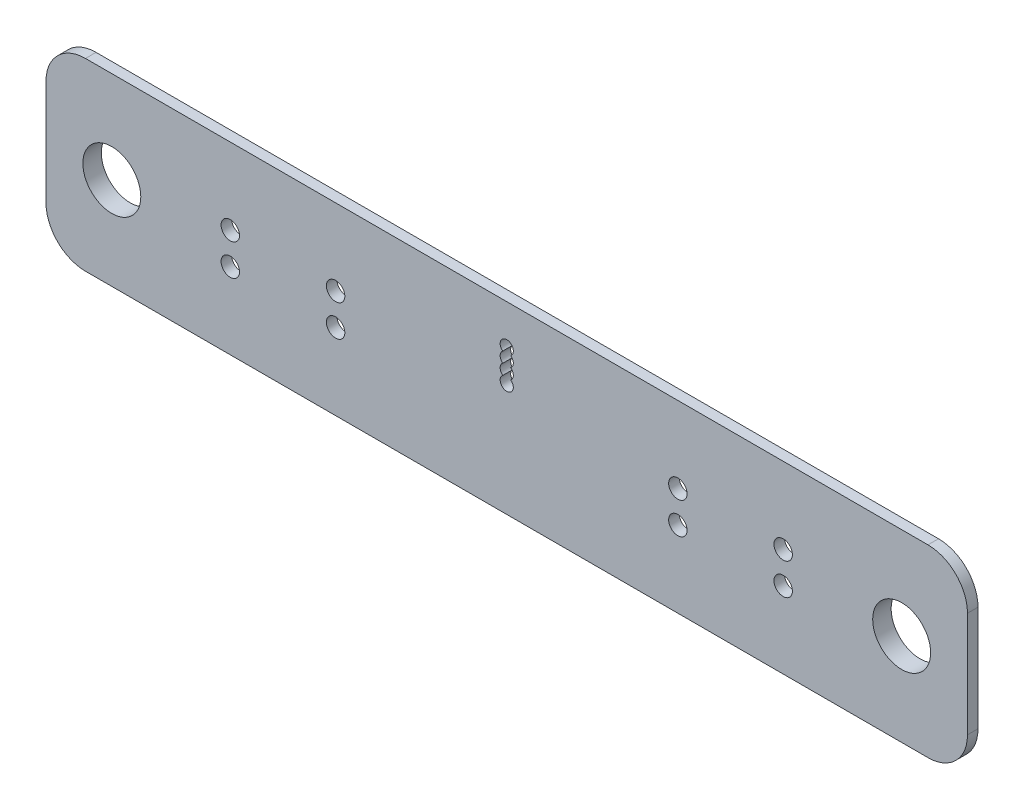
ISO-10303-21;
HEADER;
FILE_DESCRIPTION(('STEP AP214'),'2;1');
FILE_NAME('part.step','',(''),(''),'','','');
FILE_SCHEMA(('AUTOMOTIVE_DESIGN { 1 0 10303 214 1 1 1 1 }'));
ENDSEC;
DATA;
#1=APPLICATION_CONTEXT('core data for automotive mechanical design processes');
#2=APPLICATION_PROTOCOL_DEFINITION('international standard','automotive_design',2000,#1);
#3=PRODUCT_CONTEXT('',#1,'mechanical');
#4=PRODUCT('Part','Part','',(#3));
#5=PRODUCT_RELATED_PRODUCT_CATEGORY('part','',(#4));
#6=PRODUCT_DEFINITION_FORMATION('','',#4);
#7=PRODUCT_DEFINITION_CONTEXT('part definition',#1,'design');
#8=PRODUCT_DEFINITION('design','',#6,#7);
#9=PRODUCT_DEFINITION_SHAPE('','',#8);
#10=(LENGTH_UNIT() NAMED_UNIT(*) SI_UNIT(.MILLI.,.METRE.));
#11=(NAMED_UNIT(*) PLANE_ANGLE_UNIT() SI_UNIT($,.RADIAN.));
#12=(NAMED_UNIT(*) SI_UNIT($,.STERADIAN.) SOLID_ANGLE_UNIT());
#13=UNCERTAINTY_MEASURE_WITH_UNIT(LENGTH_MEASURE(1.E-05),#10,'distance_accuracy_value','');
#14=(GEOMETRIC_REPRESENTATION_CONTEXT(3) GLOBAL_UNCERTAINTY_ASSIGNED_CONTEXT((#13)) GLOBAL_UNIT_ASSIGNED_CONTEXT((#10,
#11,#12)) REPRESENTATION_CONTEXT('',''));
#15=CARTESIAN_POINT('',(0.,0.,0.));
#16=DIRECTION('',(0.,0.,1.));
#17=DIRECTION('',(1.,0.,0.));
#18=AXIS2_PLACEMENT_3D('',#15,#16,#17);
#19=CARTESIAN_POINT('',(0.,0.,0.));
#20=DIRECTION('',(0.,0.,1.));
#21=DIRECTION('',(1.,0.,0.));
#22=AXIS2_PLACEMENT_3D('',#19,#20,#21);
#23=PLANE('',#22);
#24=CARTESIAN_POINT('',(150.,0.,0.));
#25=DIRECTION('',(0.,0.,1.));
#26=DIRECTION('',(1.,0.,0.));
#27=AXIS2_PLACEMENT_3D('',#24,#25,#26);
#28=CIRCLE('',#27,13.5);
#29=CARTESIAN_POINT('',(163.5,0.,0.));
#30=VERTEX_POINT('',#29);
#31=EDGE_CURVE('E42',#30,#30,#28,.F.);
#32=ORIENTED_EDGE('',*,*,#31,.F.);
#33=EDGE_LOOP('',(#32));
#34=FACE_BOUND('',#33,.T.);
#35=CARTESIAN_POINT('',(105.,6.,0.));
#36=DIRECTION('',(0.,0.,1.));
#37=DIRECTION('',(1.,0.,0.));
#38=AXIS2_PLACEMENT_3D('',#35,#36,#37);
#39=CIRCLE('',#38,3.50000000000001);
#40=CARTESIAN_POINT('',(108.5,6.,0.));
#41=VERTEX_POINT('',#40);
#42=EDGE_CURVE('E214',#41,#41,#39,.T.);
#43=ORIENTED_EDGE('',*,*,#42,.T.);
#44=EDGE_LOOP('',(#43));
#45=FACE_BOUND('',#44,.T.);
#46=CARTESIAN_POINT('',(-105.,-6.,0.));
#47=DIRECTION('',(0.,0.,1.));
#48=DIRECTION('',(1.,0.,0.));
#49=AXIS2_PLACEMENT_3D('',#46,#47,#48);
#50=CIRCLE('',#49,3.50000000000001);
#51=CARTESIAN_POINT('',(-101.5,-6.,0.));
#52=VERTEX_POINT('',#51);
#53=EDGE_CURVE('E211',#52,#52,#50,.T.);
#54=ORIENTED_EDGE('',*,*,#53,.T.);
#55=EDGE_LOOP('',(#54));
#56=FACE_BOUND('',#55,.T.);
#57=CARTESIAN_POINT('',(-65.,-6.,0.));
#58=DIRECTION('',(0.,0.,1.));
#59=DIRECTION('',(1.,0.,0.));
#60=AXIS2_PLACEMENT_3D('',#57,#58,#59);
#61=CIRCLE('',#60,3.50000000000001);
#62=CARTESIAN_POINT('',(-61.5,-6.,0.));
#63=VERTEX_POINT('',#62);
#64=EDGE_CURVE('E208',#63,#63,#61,.T.);
#65=ORIENTED_EDGE('',*,*,#64,.T.);
#66=EDGE_LOOP('',(#65));
#67=FACE_BOUND('',#66,.T.);
#68=CARTESIAN_POINT('',(-65.,6.,0.));
#69=DIRECTION('',(0.,0.,1.));
#70=DIRECTION('',(1.,0.,0.));
#71=AXIS2_PLACEMENT_3D('',#68,#69,#70);
#72=CIRCLE('',#71,3.50000000000001);
#73=CARTESIAN_POINT('',(-61.5,6.,0.));
#74=VERTEX_POINT('',#73);
#75=EDGE_CURVE('E205',#74,#74,#72,.T.);
#76=ORIENTED_EDGE('',*,*,#75,.T.);
#77=EDGE_LOOP('',(#76));
#78=FACE_BOUND('',#77,.T.);
#79=CARTESIAN_POINT('',(65.,6.,0.));
#80=DIRECTION('',(0.,0.,1.));
#81=DIRECTION('',(1.,0.,0.));
#82=AXIS2_PLACEMENT_3D('',#79,#80,#81);
#83=CIRCLE('',#82,3.50000000000001);
#84=CARTESIAN_POINT('',(68.5,6.,0.));
#85=VERTEX_POINT('',#84);
#86=EDGE_CURVE('E202',#85,#85,#83,.T.);
#87=ORIENTED_EDGE('',*,*,#86,.T.);
#88=EDGE_LOOP('',(#87));
#89=FACE_BOUND('',#88,.T.);
#90=CARTESIAN_POINT('',(65.,-6.,0.));
#91=DIRECTION('',(0.,0.,1.));
#92=DIRECTION('',(1.,0.,0.));
#93=AXIS2_PLACEMENT_3D('',#90,#91,#92);
#94=CIRCLE('',#93,3.50000000000001);
#95=CARTESIAN_POINT('',(68.5,-6.,0.));
#96=VERTEX_POINT('',#95);
#97=EDGE_CURVE('E199',#96,#96,#94,.T.);
#98=ORIENTED_EDGE('',*,*,#97,.T.);
#99=EDGE_LOOP('',(#98));
#100=FACE_BOUND('',#99,.T.);
#101=CARTESIAN_POINT('',(105.,-6.,0.));
#102=DIRECTION('',(0.,0.,1.));
#103=DIRECTION('',(1.,0.,0.));
#104=AXIS2_PLACEMENT_3D('',#101,#102,#103);
#105=CIRCLE('',#104,3.50000000000001);
#106=CARTESIAN_POINT('',(108.5,-6.,0.));
#107=VERTEX_POINT('',#106);
#108=EDGE_CURVE('E196',#107,#107,#105,.T.);
#109=ORIENTED_EDGE('',*,*,#108,.T.);
#110=EDGE_LOOP('',(#109));
#111=FACE_BOUND('',#110,.T.);
#112=CARTESIAN_POINT('',(0.,12.,0.));
#113=DIRECTION('',(0.,0.,1.));
#114=DIRECTION('',(1.,0.,0.));
#115=AXIS2_PLACEMENT_3D('',#112,#113,#114);
#116=CIRCLE('',#115,2.5);
#117=CARTESIAN_POINT('',(1.50000000000011,10.,0.));
#118=VERTEX_POINT('',#117);
#119=CARTESIAN_POINT('',(1.50000000000006,14.,0.));
#120=VERTEX_POINT('',#119);
#121=EDGE_CURVE('E190',#118,#120,#116,.T.);
#122=ORIENTED_EDGE('',*,*,#121,.T.);
#123=CARTESIAN_POINT('',(0.,16.,0.));
#124=DIRECTION('',(0.,0.,1.));
#125=DIRECTION('',(1.,0.,0.));
#126=AXIS2_PLACEMENT_3D('',#123,#124,#125);
#127=CIRCLE('',#126,2.5);
#128=CARTESIAN_POINT('',(1.50000000000002,18.,0.));
#129=VERTEX_POINT('',#128);
#130=EDGE_CURVE('E193',#120,#129,#127,.T.);
#131=ORIENTED_EDGE('',*,*,#130,.T.);
#132=CARTESIAN_POINT('',(0.,20.,0.));
#133=DIRECTION('',(0.,0.,1.));
#134=DIRECTION('',(1.,0.,0.));
#135=AXIS2_PLACEMENT_3D('',#132,#133,#134);
#136=CIRCLE('',#135,2.5);
#137=CARTESIAN_POINT('',(-1.49999999999998,18.,0.));
#138=VERTEX_POINT('',#137);
#139=EDGE_CURVE('E178',#129,#138,#136,.T.);
#140=ORIENTED_EDGE('',*,*,#139,.T.);
#141=CARTESIAN_POINT('',(0.,16.,0.));
#142=DIRECTION('',(0.,0.,1.));
#143=DIRECTION('',(1.,0.,0.));
#144=AXIS2_PLACEMENT_3D('',#141,#142,#143);
#145=CIRCLE('',#144,2.5);
#146=CARTESIAN_POINT('',(-1.49999999999994,14.,0.));
#147=VERTEX_POINT('',#146);
#148=EDGE_CURVE('E141',#138,#147,#145,.T.);
#149=ORIENTED_EDGE('',*,*,#148,.T.);
#150=CARTESIAN_POINT('',(0.,12.,0.));
#151=DIRECTION('',(0.,0.,1.));
#152=DIRECTION('',(1.,0.,0.));
#153=AXIS2_PLACEMENT_3D('',#150,#151,#152);
#154=CIRCLE('',#153,2.5);
#155=CARTESIAN_POINT('',(-1.49999999999989,9.99999999999998,0.));
#156=VERTEX_POINT('',#155);
#157=EDGE_CURVE('E184',#147,#156,#154,.T.);
#158=ORIENTED_EDGE('',*,*,#157,.T.);
#159=CARTESIAN_POINT('',(1.26305651597926E-13,8.,0.));
#160=DIRECTION('',(0.,0.,1.));
#161=DIRECTION('',(1.,0.,0.));
#162=AXIS2_PLACEMENT_3D('',#159,#160,#161);
#163=CIRCLE('',#162,2.5);
#164=EDGE_CURVE('E187',#156,#118,#163,.T.);
#165=ORIENTED_EDGE('',*,*,#164,.T.);
#166=EDGE_LOOP('',(#122,#131,#140,#149,#158,#165));
#167=FACE_BOUND('',#166,.T.);
#168=CARTESIAN_POINT('',(-105.,6.,0.));
#169=DIRECTION('',(0.,0.,1.));
#170=DIRECTION('',(1.,0.,0.));
#171=AXIS2_PLACEMENT_3D('',#168,#169,#170);
#172=CIRCLE('',#171,3.50000000000001);
#173=CARTESIAN_POINT('',(-101.5,6.,0.));
#174=VERTEX_POINT('',#173);
#175=EDGE_CURVE('E220',#174,#174,#172,.T.);
#176=ORIENTED_EDGE('',*,*,#175,.T.);
#177=EDGE_LOOP('',(#176));
#178=FACE_BOUND('',#177,.T.);
#179=DIRECTION('',(0.,1.,0.));
#180=VECTOR('',#179,1.);
#181=CARTESIAN_POINT('',(175.,35.,0.));
#182=LINE('',#181,#180);
#183=CARTESIAN_POINT('',(175.,-20.,0.));
#184=VERTEX_POINT('',#183);
#185=CARTESIAN_POINT('',(175.,20.,0.));
#186=VERTEX_POINT('',#185);
#187=EDGE_CURVE('E227',#184,#186,#182,.T.);
#188=ORIENTED_EDGE('',*,*,#187,.F.);
#189=CARTESIAN_POINT('',(160.,-20.,0.));
#190=DIRECTION('',(0.,0.,1.));
#191=DIRECTION('',(1.,0.,0.));
#192=AXIS2_PLACEMENT_3D('',#189,#190,#191);
#193=CIRCLE('',#192,15.);
#194=CARTESIAN_POINT('',(160.,-35.,0.));
#195=VERTEX_POINT('',#194);
#196=EDGE_CURVE('E262',#184,#195,#193,.F.);
#197=ORIENTED_EDGE('',*,*,#196,.T.);
#198=DIRECTION('',(1.,0.,0.));
#199=VECTOR('',#198,1.);
#200=CARTESIAN_POINT('',(-175.,-35.,0.));
#201=LINE('',#200,#199);
#202=CARTESIAN_POINT('',(-160.,-35.,0.));
#203=VERTEX_POINT('',#202);
#204=EDGE_CURVE('E232',#203,#195,#201,.T.);
#205=ORIENTED_EDGE('',*,*,#204,.F.);
#206=CARTESIAN_POINT('',(-160.,-20.,0.));
#207=DIRECTION('',(0.,0.,1.));
#208=DIRECTION('',(1.,0.,0.));
#209=AXIS2_PLACEMENT_3D('',#206,#207,#208);
#210=CIRCLE('',#209,15.);
#211=CARTESIAN_POINT('',(-175.,-20.,0.));
#212=VERTEX_POINT('',#211);
#213=EDGE_CURVE('E258',#203,#212,#210,.F.);
#214=ORIENTED_EDGE('',*,*,#213,.T.);
#215=DIRECTION('',(0.,-1.,0.));
#216=VECTOR('',#215,1.);
#217=CARTESIAN_POINT('',(-175.,35.,0.));
#218=LINE('',#217,#216);
#219=CARTESIAN_POINT('',(-175.,20.,0.));
#220=VERTEX_POINT('',#219);
#221=EDGE_CURVE('E247',#220,#212,#218,.T.);
#222=ORIENTED_EDGE('',*,*,#221,.F.);
#223=CARTESIAN_POINT('',(-160.,20.,0.));
#224=DIRECTION('',(0.,0.,1.));
#225=DIRECTION('',(1.,0.,0.));
#226=AXIS2_PLACEMENT_3D('',#223,#224,#225);
#227=CIRCLE('',#226,15.);
#228=CARTESIAN_POINT('',(-160.,35.,0.));
#229=VERTEX_POINT('',#228);
#230=EDGE_CURVE('E256',#220,#229,#227,.F.);
#231=ORIENTED_EDGE('',*,*,#230,.T.);
#232=DIRECTION('',(-1.,0.,0.));
#233=VECTOR('',#232,1.);
#234=CARTESIAN_POINT('',(-175.,35.,0.));
#235=LINE('',#234,#233);
#236=CARTESIAN_POINT('',(160.,35.,0.));
#237=VERTEX_POINT('',#236);
#238=EDGE_CURVE('E244',#237,#229,#235,.T.);
#239=ORIENTED_EDGE('',*,*,#238,.F.);
#240=CARTESIAN_POINT('',(160.,20.,0.));
#241=DIRECTION('',(0.,0.,1.));
#242=DIRECTION('',(1.,0.,0.));
#243=AXIS2_PLACEMENT_3D('',#240,#241,#242);
#244=CIRCLE('',#243,15.);
#245=EDGE_CURVE('E260',#237,#186,#244,.F.);
#246=ORIENTED_EDGE('',*,*,#245,.T.);
#247=EDGE_LOOP('',(#188,#197,#205,#214,#222,#231,#239,#246));
#248=FACE_BOUND('',#247,.T.);
#249=CARTESIAN_POINT('',(-150.,0.,0.));
#250=DIRECTION('',(0.,0.,1.));
#251=DIRECTION('',(1.,0.,0.));
#252=AXIS2_PLACEMENT_3D('',#249,#250,#251);
#253=CIRCLE('',#252,13.5);
#254=CARTESIAN_POINT('',(-136.5,0.,0.));
#255=VERTEX_POINT('',#254);
#256=EDGE_CURVE('E11',#255,#255,#253,.F.);
#257=ORIENTED_EDGE('',*,*,#256,.F.);
#258=EDGE_LOOP('',(#257));
#259=FACE_BOUND('',#258,.T.);
#260=ADVANCED_FACE('F34',(#34,#45,#56,#67,#78,#89,#100,#111,#167,#178,#248,#259),#23,.F.);
#261=CARTESIAN_POINT('',(175.,35.,4.));
#262=DIRECTION('',(-1.,0.,0.));
#263=DIRECTION('',(0.,-1.,0.));
#264=AXIS2_PLACEMENT_3D('',#261,#262,#263);
#265=PLANE('',#264);
#266=DIRECTION('',(0.,1.,0.));
#267=VECTOR('',#266,1.);
#268=CARTESIAN_POINT('',(175.,35.,4.));
#269=LINE('',#268,#267);
#270=CARTESIAN_POINT('',(175.,-20.,4.));
#271=VERTEX_POINT('',#270);
#272=CARTESIAN_POINT('',(175.,20.,4.));
#273=VERTEX_POINT('',#272);
#274=EDGE_CURVE('E228',#271,#273,#269,.T.);
#275=ORIENTED_EDGE('',*,*,#274,.F.);
#276=DIRECTION('',(0.,0.,-1.));
#277=VECTOR('',#276,1.);
#278=CARTESIAN_POINT('',(175.,-20.,4.));
#279=LINE('',#278,#277);
#280=EDGE_CURVE('E253',#271,#184,#279,.T.);
#281=ORIENTED_EDGE('',*,*,#280,.T.);
#282=ORIENTED_EDGE('',*,*,#187,.T.);
#283=DIRECTION('',(0.,0.,-1.));
#284=VECTOR('',#283,1.);
#285=CARTESIAN_POINT('',(175.,20.,4.));
#286=LINE('',#285,#284);
#287=EDGE_CURVE('E241',#186,#273,#286,.F.);
#288=ORIENTED_EDGE('',*,*,#287,.T.);
#289=EDGE_LOOP('',(#275,#281,#282,#288));
#290=FACE_BOUND('',#289,.T.);
#291=ADVANCED_FACE('F295',(#290),#265,.F.);
#292=CARTESIAN_POINT('',(-175.,35.,4.));
#293=DIRECTION('',(0.,-1.,0.));
#294=DIRECTION('',(0.,0.,-1.));
#295=AXIS2_PLACEMENT_3D('',#292,#293,#294);
#296=PLANE('',#295);
#297=DIRECTION('',(-1.,0.,0.));
#298=VECTOR('',#297,1.);
#299=CARTESIAN_POINT('',(-175.,35.,4.));
#300=LINE('',#299,#298);
#301=CARTESIAN_POINT('',(160.,35.,4.));
#302=VERTEX_POINT('',#301);
#303=CARTESIAN_POINT('',(-160.,35.,4.));
#304=VERTEX_POINT('',#303);
#305=EDGE_CURVE('E231',#302,#304,#300,.T.);
#306=ORIENTED_EDGE('',*,*,#305,.F.);
#307=DIRECTION('',(0.,0.,-1.));
#308=VECTOR('',#307,1.);
#309=CARTESIAN_POINT('',(160.,35.,4.));
#310=LINE('',#309,#308);
#311=EDGE_CURVE('E279',#302,#237,#310,.T.);
#312=ORIENTED_EDGE('',*,*,#311,.T.);
#313=ORIENTED_EDGE('',*,*,#238,.T.);
#314=DIRECTION('',(0.,0.,-1.));
#315=VECTOR('',#314,1.);
#316=CARTESIAN_POINT('',(-160.,35.,4.));
#317=LINE('',#316,#315);
#318=EDGE_CURVE('E277',#229,#304,#317,.F.);
#319=ORIENTED_EDGE('',*,*,#318,.T.);
#320=EDGE_LOOP('',(#306,#312,#313,#319));
#321=FACE_BOUND('',#320,.T.);
#322=ADVANCED_FACE('F407',(#321),#296,.F.);
#323=CARTESIAN_POINT('',(-175.,35.,4.));
#324=DIRECTION('',(1.,0.,0.));
#325=DIRECTION('',(0.,0.,-1.));
#326=AXIS2_PLACEMENT_3D('',#323,#324,#325);
#327=PLANE('',#326);
#328=ORIENTED_EDGE('',*,*,#221,.T.);
#329=DIRECTION('',(0.,0.,-1.));
#330=VECTOR('',#329,1.);
#331=CARTESIAN_POINT('',(-175.,-20.,4.));
#332=LINE('',#331,#330);
#333=CARTESIAN_POINT('',(-175.,-20.,4.));
#334=VERTEX_POINT('',#333);
#335=EDGE_CURVE('E285',#212,#334,#332,.F.);
#336=ORIENTED_EDGE('',*,*,#335,.T.);
#337=DIRECTION('',(0.,-1.,0.));
#338=VECTOR('',#337,1.);
#339=CARTESIAN_POINT('',(-175.,35.,4.));
#340=LINE('',#339,#338);
#341=CARTESIAN_POINT('',(-175.,20.,4.));
#342=VERTEX_POINT('',#341);
#343=EDGE_CURVE('E235',#342,#334,#340,.T.);
#344=ORIENTED_EDGE('',*,*,#343,.F.);
#345=DIRECTION('',(0.,0.,-1.));
#346=VECTOR('',#345,1.);
#347=CARTESIAN_POINT('',(-175.,20.,4.));
#348=LINE('',#347,#346);
#349=EDGE_CURVE('E282',#342,#220,#348,.T.);
#350=ORIENTED_EDGE('',*,*,#349,.T.);
#351=EDGE_LOOP('',(#328,#336,#344,#350));
#352=FACE_BOUND('',#351,.T.);
#353=ADVANCED_FACE('F403',(#352),#327,.F.);
#354=CARTESIAN_POINT('',(-175.,-35.,4.));
#355=DIRECTION('',(0.,1.,0.));
#356=DIRECTION('',(0.,0.,1.));
#357=AXIS2_PLACEMENT_3D('',#354,#355,#356);
#358=PLANE('',#357);
#359=ORIENTED_EDGE('',*,*,#204,.T.);
#360=DIRECTION('',(0.,0.,-1.));
#361=VECTOR('',#360,1.);
#362=CARTESIAN_POINT('',(160.,-35.,4.));
#363=LINE('',#362,#361);
#364=CARTESIAN_POINT('',(160.,-35.,4.));
#365=VERTEX_POINT('',#364);
#366=EDGE_CURVE('E267',#195,#365,#363,.F.);
#367=ORIENTED_EDGE('',*,*,#366,.T.);
#368=DIRECTION('',(1.,0.,0.));
#369=VECTOR('',#368,1.);
#370=CARTESIAN_POINT('',(-175.,-35.,4.));
#371=LINE('',#370,#369);
#372=CARTESIAN_POINT('',(-160.,-35.,4.));
#373=VERTEX_POINT('',#372);
#374=EDGE_CURVE('E238',#373,#365,#371,.T.);
#375=ORIENTED_EDGE('',*,*,#374,.F.);
#376=DIRECTION('',(0.,0.,-1.));
#377=VECTOR('',#376,1.);
#378=CARTESIAN_POINT('',(-160.,-35.,4.));
#379=LINE('',#378,#377);
#380=EDGE_CURVE('E264',#373,#203,#379,.T.);
#381=ORIENTED_EDGE('',*,*,#380,.T.);
#382=EDGE_LOOP('',(#359,#367,#375,#381));
#383=FACE_BOUND('',#382,.T.);
#384=ADVANCED_FACE('F398',(#383),#358,.F.);
#385=CARTESIAN_POINT('',(0.,0.,4.));
#386=DIRECTION('',(0.,0.,1.));
#387=DIRECTION('',(1.,0.,0.));
#388=AXIS2_PLACEMENT_3D('',#385,#386,#387);
#389=PLANE('',#388);
#390=CARTESIAN_POINT('',(105.,6.,4.));
#391=DIRECTION('',(0.,0.,1.));
#392=DIRECTION('',(-1.,0.,0.));
#393=AXIS2_PLACEMENT_3D('',#390,#391,#392);
#394=CIRCLE('',#393,3.50000000000001);
#395=CARTESIAN_POINT('',(101.5,6.,4.));
#396=VERTEX_POINT('',#395);
#397=EDGE_CURVE('E642',#396,#396,#394,.T.);
#398=ORIENTED_EDGE('',*,*,#397,.F.);
#399=EDGE_LOOP('',(#398));
#400=FACE_BOUND('',#399,.T.);
#401=CARTESIAN_POINT('',(-105.,-6.,4.));
#402=DIRECTION('',(0.,0.,1.));
#403=DIRECTION('',(1.,0.,0.));
#404=AXIS2_PLACEMENT_3D('',#401,#402,#403);
#405=CIRCLE('',#404,3.50000000000001);
#406=CARTESIAN_POINT('',(-101.5,-6.,4.));
#407=VERTEX_POINT('',#406);
#408=EDGE_CURVE('E646',#407,#407,#405,.T.);
#409=ORIENTED_EDGE('',*,*,#408,.F.);
#410=EDGE_LOOP('',(#409));
#411=FACE_BOUND('',#410,.T.);
#412=CARTESIAN_POINT('',(-65.,-6.,4.));
#413=DIRECTION('',(0.,0.,1.));
#414=DIRECTION('',(1.,0.,0.));
#415=AXIS2_PLACEMENT_3D('',#412,#413,#414);
#416=CIRCLE('',#415,3.50000000000001);
#417=CARTESIAN_POINT('',(-61.5,-6.,4.));
#418=VERTEX_POINT('',#417);
#419=EDGE_CURVE('E650',#418,#418,#416,.T.);
#420=ORIENTED_EDGE('',*,*,#419,.F.);
#421=EDGE_LOOP('',(#420));
#422=FACE_BOUND('',#421,.T.);
#423=CARTESIAN_POINT('',(-65.,6.,4.));
#424=DIRECTION('',(0.,0.,1.));
#425=DIRECTION('',(1.,0.,0.));
#426=AXIS2_PLACEMENT_3D('',#423,#424,#425);
#427=CIRCLE('',#426,3.50000000000001);
#428=CARTESIAN_POINT('',(-61.5,6.,4.));
#429=VERTEX_POINT('',#428);
#430=EDGE_CURVE('E654',#429,#429,#427,.T.);
#431=ORIENTED_EDGE('',*,*,#430,.F.);
#432=EDGE_LOOP('',(#431));
#433=FACE_BOUND('',#432,.T.);
#434=CARTESIAN_POINT('',(65.,6.,4.));
#435=DIRECTION('',(0.,0.,1.));
#436=DIRECTION('',(-1.,0.,0.));
#437=AXIS2_PLACEMENT_3D('',#434,#435,#436);
#438=CIRCLE('',#437,3.50000000000001);
#439=CARTESIAN_POINT('',(61.5,6.,4.));
#440=VERTEX_POINT('',#439);
#441=EDGE_CURVE('E175',#440,#440,#438,.T.);
#442=ORIENTED_EDGE('',*,*,#441,.F.);
#443=EDGE_LOOP('',(#442));
#444=FACE_BOUND('',#443,.T.);
#445=CARTESIAN_POINT('',(65.,-6.,4.));
#446=DIRECTION('',(0.,0.,1.));
#447=DIRECTION('',(-1.,0.,0.));
#448=AXIS2_PLACEMENT_3D('',#445,#446,#447);
#449=CIRCLE('',#448,3.50000000000001);
#450=CARTESIAN_POINT('',(61.5,-6.,4.));
#451=VERTEX_POINT('',#450);
#452=EDGE_CURVE('E179',#451,#451,#449,.T.);
#453=ORIENTED_EDGE('',*,*,#452,.F.);
#454=EDGE_LOOP('',(#453));
#455=FACE_BOUND('',#454,.T.);
#456=CARTESIAN_POINT('',(105.,-6.,4.));
#457=DIRECTION('',(0.,0.,1.));
#458=DIRECTION('',(-1.,0.,0.));
#459=AXIS2_PLACEMENT_3D('',#456,#457,#458);
#460=CIRCLE('',#459,3.50000000000001);
#461=CARTESIAN_POINT('',(101.5,-6.,4.));
#462=VERTEX_POINT('',#461);
#463=EDGE_CURVE('E168',#462,#462,#460,.T.);
#464=ORIENTED_EDGE('',*,*,#463,.F.);
#465=EDGE_LOOP('',(#464));
#466=FACE_BOUND('',#465,.T.);
#467=CARTESIAN_POINT('',(0.,16.,4.));
#468=DIRECTION('',(0.,0.,1.));
#469=DIRECTION('',(1.,0.,0.));
#470=AXIS2_PLACEMENT_3D('',#467,#468,#469);
#471=CIRCLE('',#470,2.5);
#472=CARTESIAN_POINT('',(1.50000000000006,14.,4.));
#473=VERTEX_POINT('',#472);
#474=CARTESIAN_POINT('',(1.50000000000002,18.,4.));
#475=VERTEX_POINT('',#474);
#476=EDGE_CURVE('E57',#473,#475,#471,.T.);
#477=ORIENTED_EDGE('',*,*,#476,.F.);
#478=CARTESIAN_POINT('',(0.,12.,4.));
#479=DIRECTION('',(0.,0.,1.));
#480=DIRECTION('',(1.,0.,0.));
#481=AXIS2_PLACEMENT_3D('',#478,#479,#480);
#482=CIRCLE('',#481,2.5);
#483=CARTESIAN_POINT('',(1.50000000000011,10.,4.));
#484=VERTEX_POINT('',#483);
#485=EDGE_CURVE('E163',#484,#473,#482,.T.);
#486=ORIENTED_EDGE('',*,*,#485,.F.);
#487=CARTESIAN_POINT('',(1.26305651597926E-13,8.,4.));
#488=DIRECTION('',(0.,0.,1.));
#489=DIRECTION('',(1.,0.,0.));
#490=AXIS2_PLACEMENT_3D('',#487,#488,#489);
#491=CIRCLE('',#490,2.5);
#492=CARTESIAN_POINT('',(-1.49999999999989,9.99999999999998,4.));
#493=VERTEX_POINT('',#492);
#494=EDGE_CURVE('E157',#493,#484,#491,.T.);
#495=ORIENTED_EDGE('',*,*,#494,.F.);
#496=CARTESIAN_POINT('',(0.,12.,4.));
#497=DIRECTION('',(0.,0.,1.));
#498=DIRECTION('',(1.,0.,0.));
#499=AXIS2_PLACEMENT_3D('',#496,#497,#498);
#500=CIRCLE('',#499,2.5);
#501=CARTESIAN_POINT('',(-1.49999999999994,14.,4.));
#502=VERTEX_POINT('',#501);
#503=EDGE_CURVE('E155',#502,#493,#500,.T.);
#504=ORIENTED_EDGE('',*,*,#503,.F.);
#505=CARTESIAN_POINT('',(0.,16.,4.));
#506=DIRECTION('',(0.,0.,1.));
#507=DIRECTION('',(1.,0.,0.));
#508=AXIS2_PLACEMENT_3D('',#505,#506,#507);
#509=CIRCLE('',#508,2.5);
#510=CARTESIAN_POINT('',(-1.49999999999998,18.,4.));
#511=VERTEX_POINT('',#510);
#512=EDGE_CURVE('E138',#511,#502,#509,.T.);
#513=ORIENTED_EDGE('',*,*,#512,.F.);
#514=CARTESIAN_POINT('',(0.,20.,4.));
#515=DIRECTION('',(0.,0.,1.));
#516=DIRECTION('',(1.,0.,0.));
#517=AXIS2_PLACEMENT_3D('',#514,#515,#516);
#518=CIRCLE('',#517,2.5);
#519=EDGE_CURVE('E147',#475,#511,#518,.T.);
#520=ORIENTED_EDGE('',*,*,#519,.F.);
#521=EDGE_LOOP('',(#477,#486,#495,#504,#513,#520));
#522=FACE_BOUND('',#521,.T.);
#523=CARTESIAN_POINT('',(-105.,6.,4.));
#524=DIRECTION('',(0.,0.,1.));
#525=DIRECTION('',(1.,0.,0.));
#526=AXIS2_PLACEMENT_3D('',#523,#524,#525);
#527=CIRCLE('',#526,3.50000000000001);
#528=CARTESIAN_POINT('',(-101.5,6.,4.));
#529=VERTEX_POINT('',#528);
#530=EDGE_CURVE('E217',#529,#529,#527,.T.);
#531=ORIENTED_EDGE('',*,*,#530,.F.);
#532=EDGE_LOOP('',(#531));
#533=FACE_BOUND('',#532,.T.);
#534=CARTESIAN_POINT('',(-150.,0.,4.));
#535=DIRECTION('',(0.,0.,1.));
#536=DIRECTION('',(1.,0.,0.));
#537=AXIS2_PLACEMENT_3D('',#534,#535,#536);
#538=CIRCLE('',#537,11.);
#539=CARTESIAN_POINT('',(-139.,0.,4.));
#540=VERTEX_POINT('',#539);
#541=EDGE_CURVE('E223',#540,#540,#538,.F.);
#542=ORIENTED_EDGE('',*,*,#541,.T.);
#543=EDGE_LOOP('',(#542));
#544=FACE_BOUND('',#543,.T.);
#545=CARTESIAN_POINT('',(150.,0.,4.));
#546=DIRECTION('',(0.,0.,1.));
#547=DIRECTION('',(1.,0.,0.));
#548=AXIS2_PLACEMENT_3D('',#545,#546,#547);
#549=CIRCLE('',#548,11.);
#550=CARTESIAN_POINT('',(161.,0.,4.));
#551=VERTEX_POINT('',#550);
#552=EDGE_CURVE('E224',#551,#551,#549,.T.);
#553=ORIENTED_EDGE('',*,*,#552,.F.);
#554=EDGE_LOOP('',(#553));
#555=FACE_BOUND('',#554,.T.);
#556=ORIENTED_EDGE('',*,*,#374,.T.);
#557=CARTESIAN_POINT('',(160.,-20.,4.));
#558=DIRECTION('',(0.,0.,1.));
#559=DIRECTION('',(1.,0.,0.));
#560=AXIS2_PLACEMENT_3D('',#557,#558,#559);
#561=CIRCLE('',#560,15.);
#562=EDGE_CURVE('E275',#365,#271,#561,.T.);
#563=ORIENTED_EDGE('',*,*,#562,.T.);
#564=ORIENTED_EDGE('',*,*,#274,.T.);
#565=CARTESIAN_POINT('',(160.,20.,4.));
#566=DIRECTION('',(0.,0.,1.));
#567=DIRECTION('',(1.,0.,0.));
#568=AXIS2_PLACEMENT_3D('',#565,#566,#567);
#569=CIRCLE('',#568,15.);
#570=EDGE_CURVE('E273',#273,#302,#569,.T.);
#571=ORIENTED_EDGE('',*,*,#570,.T.);
#572=ORIENTED_EDGE('',*,*,#305,.T.);
#573=CARTESIAN_POINT('',(-160.,20.,4.));
#574=DIRECTION('',(0.,0.,1.));
#575=DIRECTION('',(1.,0.,0.));
#576=AXIS2_PLACEMENT_3D('',#573,#574,#575);
#577=CIRCLE('',#576,15.);
#578=EDGE_CURVE('E269',#304,#342,#577,.T.);
#579=ORIENTED_EDGE('',*,*,#578,.T.);
#580=ORIENTED_EDGE('',*,*,#343,.T.);
#581=CARTESIAN_POINT('',(-160.,-20.,4.));
#582=DIRECTION('',(0.,0.,1.));
#583=DIRECTION('',(1.,0.,0.));
#584=AXIS2_PLACEMENT_3D('',#581,#582,#583);
#585=CIRCLE('',#584,15.);
#586=EDGE_CURVE('E271',#334,#373,#585,.T.);
#587=ORIENTED_EDGE('',*,*,#586,.T.);
#588=EDGE_LOOP('',(#556,#563,#564,#571,#572,#579,#580,#587));
#589=FACE_BOUND('',#588,.T.);
#590=ADVANCED_FACE('F151',(#400,#411,#422,#433,#444,#455,#466,#522,#533,#544,#555,#589),#389,.T.);
#591=CARTESIAN_POINT('',(160.,-20.,4.));
#592=DIRECTION('',(0.,0.,-1.));
#593=DIRECTION('',(-1.,0.,0.));
#594=AXIS2_PLACEMENT_3D('',#591,#592,#593);
#595=CYLINDRICAL_SURFACE('',#594,15.);
#596=ORIENTED_EDGE('',*,*,#562,.F.);
#597=ORIENTED_EDGE('',*,*,#366,.F.);
#598=ORIENTED_EDGE('',*,*,#196,.F.);
#599=ORIENTED_EDGE('',*,*,#280,.F.);
#600=EDGE_LOOP('',(#596,#597,#598,#599));
#601=FACE_BOUND('',#600,.T.);
#602=ADVANCED_FACE('F397',(#601),#595,.T.);
#603=CARTESIAN_POINT('',(160.,20.,4.));
#604=DIRECTION('',(0.,0.,-1.));
#605=DIRECTION('',(-1.,0.,0.));
#606=AXIS2_PLACEMENT_3D('',#603,#604,#605);
#607=CYLINDRICAL_SURFACE('',#606,15.);
#608=ORIENTED_EDGE('',*,*,#570,.F.);
#609=ORIENTED_EDGE('',*,*,#287,.F.);
#610=ORIENTED_EDGE('',*,*,#245,.F.);
#611=ORIENTED_EDGE('',*,*,#311,.F.);
#612=EDGE_LOOP('',(#608,#609,#610,#611));
#613=FACE_BOUND('',#612,.T.);
#614=ADVANCED_FACE('F417',(#613),#607,.T.);
#615=CARTESIAN_POINT('',(-160.,-20.,4.));
#616=DIRECTION('',(0.,0.,-1.));
#617=DIRECTION('',(-1.,0.,0.));
#618=AXIS2_PLACEMENT_3D('',#615,#616,#617);
#619=CYLINDRICAL_SURFACE('',#618,15.);
#620=ORIENTED_EDGE('',*,*,#586,.F.);
#621=ORIENTED_EDGE('',*,*,#335,.F.);
#622=ORIENTED_EDGE('',*,*,#213,.F.);
#623=ORIENTED_EDGE('',*,*,#380,.F.);
#624=EDGE_LOOP('',(#620,#621,#622,#623));
#625=FACE_BOUND('',#624,.T.);
#626=ADVANCED_FACE('F420',(#625),#619,.T.);
#627=CARTESIAN_POINT('',(-160.,20.,4.));
#628=DIRECTION('',(0.,0.,-1.));
#629=DIRECTION('',(-1.,0.,0.));
#630=AXIS2_PLACEMENT_3D('',#627,#628,#629);
#631=CYLINDRICAL_SURFACE('',#630,15.);
#632=ORIENTED_EDGE('',*,*,#578,.F.);
#633=ORIENTED_EDGE('',*,*,#318,.F.);
#634=ORIENTED_EDGE('',*,*,#230,.F.);
#635=ORIENTED_EDGE('',*,*,#349,.F.);
#636=EDGE_LOOP('',(#632,#633,#634,#635));
#637=FACE_BOUND('',#636,.T.);
#638=ADVANCED_FACE('F36',(#637),#631,.T.);
#639=CARTESIAN_POINT('',(150.,0.,10.));
#640=DIRECTION('',(0.,0.,-1.));
#641=DIRECTION('',(-1.,0.,0.));
#642=AXIS2_PLACEMENT_3D('',#639,#640,#641);
#643=CYLINDRICAL_SURFACE('',#642,11.);
#644=ORIENTED_EDGE('',*,*,#552,.T.);
#645=EDGE_LOOP('',(#644));
#646=FACE_BOUND('',#645,.T.);
#647=CARTESIAN_POINT('',(150.,0.,-3.));
#648=DIRECTION('',(0.,0.,-1.));
#649=DIRECTION('',(-1.,0.,0.));
#650=AXIS2_PLACEMENT_3D('',#647,#648,#649);
#651=CIRCLE('',#650,11.);
#652=CARTESIAN_POINT('',(139.,0.,-3.));
#653=VERTEX_POINT('',#652);
#654=EDGE_CURVE('E670',#653,#653,#651,.T.);
#655=ORIENTED_EDGE('',*,*,#654,.T.);
#656=EDGE_LOOP('',(#655));
#657=FACE_BOUND('',#656,.T.);
#658=ADVANCED_FACE('F391',(#646,#657),#643,.F.);
#659=CARTESIAN_POINT('',(-150.,0.,10.));
#660=DIRECTION('',(0.,0.,-1.));
#661=DIRECTION('',(-1.,0.,0.));
#662=AXIS2_PLACEMENT_3D('',#659,#660,#661);
#663=CYLINDRICAL_SURFACE('',#662,11.);
#664=ORIENTED_EDGE('',*,*,#541,.F.);
#665=EDGE_LOOP('',(#664));
#666=FACE_BOUND('',#665,.T.);
#667=CARTESIAN_POINT('',(-150.,0.,-3.));
#668=DIRECTION('',(0.,0.,-1.));
#669=DIRECTION('',(-1.,0.,0.));
#670=AXIS2_PLACEMENT_3D('',#667,#668,#669);
#671=CIRCLE('',#670,11.);
#672=CARTESIAN_POINT('',(-161.,0.,-3.));
#673=VERTEX_POINT('',#672);
#674=EDGE_CURVE('E676',#673,#673,#671,.T.);
#675=ORIENTED_EDGE('',*,*,#674,.T.);
#676=EDGE_LOOP('',(#675));
#677=FACE_BOUND('',#676,.T.);
#678=ADVANCED_FACE('F387',(#666,#677),#663,.F.);
#679=CARTESIAN_POINT('',(-105.,6.,-6.));
#680=DIRECTION('',(0.,0.,1.));
#681=DIRECTION('',(1.,0.,0.));
#682=AXIS2_PLACEMENT_3D('',#679,#680,#681);
#683=CYLINDRICAL_SURFACE('',#682,3.50000000000001);
#684=ORIENTED_EDGE('',*,*,#530,.T.);
#685=EDGE_LOOP('',(#684));
#686=FACE_BOUND('',#685,.T.);
#687=ORIENTED_EDGE('',*,*,#175,.F.);
#688=EDGE_LOOP('',(#687));
#689=FACE_BOUND('',#688,.T.);
#690=ADVANCED_FACE('F378',(#686,#689),#683,.F.);
#691=CARTESIAN_POINT('',(0.,16.,-6.));
#692=DIRECTION('',(0.,0.,1.));
#693=DIRECTION('',(1.,0.,0.));
#694=AXIS2_PLACEMENT_3D('',#691,#692,#693);
#695=CYLINDRICAL_SURFACE('',#694,2.5);
#696=DIRECTION('',(0.,0.,1.));
#697=VECTOR('',#696,1.);
#698=CARTESIAN_POINT('',(1.50000000000006,14.,-6.));
#699=LINE('',#698,#697);
#700=EDGE_CURVE('E166',#120,#473,#699,.T.);
#701=ORIENTED_EDGE('',*,*,#700,.T.);
#702=ORIENTED_EDGE('',*,*,#476,.T.);
#703=DIRECTION('',(0.,0.,1.));
#704=VECTOR('',#703,1.);
#705=CARTESIAN_POINT('',(1.50000000000002,18.,-6.));
#706=LINE('',#705,#704);
#707=EDGE_CURVE('E144',#129,#475,#706,.T.);
#708=ORIENTED_EDGE('',*,*,#707,.F.);
#709=ORIENTED_EDGE('',*,*,#130,.F.);
#710=EDGE_LOOP('',(#701,#702,#708,#709));
#711=FACE_BOUND('',#710,.T.);
#712=ADVANCED_FACE('F363',(#711),#695,.F.);
#713=CARTESIAN_POINT('',(0.,12.,-6.));
#714=DIRECTION('',(0.,0.,1.));
#715=DIRECTION('',(1.,0.,0.));
#716=AXIS2_PLACEMENT_3D('',#713,#714,#715);
#717=CYLINDRICAL_SURFACE('',#716,2.5);
#718=DIRECTION('',(0.,0.,1.));
#719=VECTOR('',#718,1.);
#720=CARTESIAN_POINT('',(1.50000000000011,10.,-6.));
#721=LINE('',#720,#719);
#722=EDGE_CURVE('E169',#118,#484,#721,.T.);
#723=ORIENTED_EDGE('',*,*,#722,.T.);
#724=ORIENTED_EDGE('',*,*,#485,.T.);
#725=ORIENTED_EDGE('',*,*,#700,.F.);
#726=ORIENTED_EDGE('',*,*,#121,.F.);
#727=EDGE_LOOP('',(#723,#724,#725,#726));
#728=FACE_BOUND('',#727,.T.);
#729=ADVANCED_FACE('F359',(#728),#717,.F.);
#730=CARTESIAN_POINT('',(1.26305651597926E-13,8.,-6.));
#731=DIRECTION('',(0.,0.,1.));
#732=DIRECTION('',(1.,0.,0.));
#733=AXIS2_PLACEMENT_3D('',#730,#731,#732);
#734=CYLINDRICAL_SURFACE('',#733,2.5);
#735=DIRECTION('',(0.,0.,1.));
#736=VECTOR('',#735,1.);
#737=CARTESIAN_POINT('',(-1.49999999999989,9.99999999999998,-6.));
#738=LINE('',#737,#736);
#739=EDGE_CURVE('E171',#156,#493,#738,.T.);
#740=ORIENTED_EDGE('',*,*,#739,.T.);
#741=ORIENTED_EDGE('',*,*,#494,.T.);
#742=ORIENTED_EDGE('',*,*,#722,.F.);
#743=ORIENTED_EDGE('',*,*,#164,.F.);
#744=EDGE_LOOP('',(#740,#741,#742,#743));
#745=FACE_BOUND('',#744,.T.);
#746=ADVANCED_FACE('F362',(#745),#734,.F.);
#747=CARTESIAN_POINT('',(0.,12.,-6.));
#748=DIRECTION('',(0.,0.,1.));
#749=DIRECTION('',(1.,0.,0.));
#750=AXIS2_PLACEMENT_3D('',#747,#748,#749);
#751=CYLINDRICAL_SURFACE('',#750,2.5);
#752=DIRECTION('',(0.,0.,1.));
#753=VECTOR('',#752,1.);
#754=CARTESIAN_POINT('',(-1.49999999999994,14.,-6.));
#755=LINE('',#754,#753);
#756=EDGE_CURVE('E143',#147,#502,#755,.T.);
#757=ORIENTED_EDGE('',*,*,#756,.T.);
#758=ORIENTED_EDGE('',*,*,#503,.T.);
#759=ORIENTED_EDGE('',*,*,#739,.F.);
#760=ORIENTED_EDGE('',*,*,#157,.F.);
#761=EDGE_LOOP('',(#757,#758,#759,#760));
#762=FACE_BOUND('',#761,.T.);
#763=ADVANCED_FACE('F367',(#762),#751,.F.);
#764=CARTESIAN_POINT('',(0.,16.,-6.));
#765=DIRECTION('',(0.,0.,1.));
#766=DIRECTION('',(1.,0.,0.));
#767=AXIS2_PLACEMENT_3D('',#764,#765,#766);
#768=CYLINDRICAL_SURFACE('',#767,2.5);
#769=DIRECTION('',(0.,0.,1.));
#770=VECTOR('',#769,1.);
#771=CARTESIAN_POINT('',(-1.49999999999998,18.,-6.));
#772=LINE('',#771,#770);
#773=EDGE_CURVE('E49',#138,#511,#772,.T.);
#774=ORIENTED_EDGE('',*,*,#773,.T.);
#775=ORIENTED_EDGE('',*,*,#512,.T.);
#776=ORIENTED_EDGE('',*,*,#756,.F.);
#777=ORIENTED_EDGE('',*,*,#148,.F.);
#778=EDGE_LOOP('',(#774,#775,#776,#777));
#779=FACE_BOUND('',#778,.T.);
#780=ADVANCED_FACE('F135',(#779),#768,.F.);
#781=CARTESIAN_POINT('',(0.,20.,-6.));
#782=DIRECTION('',(0.,0.,1.));
#783=DIRECTION('',(1.,0.,0.));
#784=AXIS2_PLACEMENT_3D('',#781,#782,#783);
#785=CYLINDRICAL_SURFACE('',#784,2.5);
#786=ORIENTED_EDGE('',*,*,#707,.T.);
#787=ORIENTED_EDGE('',*,*,#519,.T.);
#788=ORIENTED_EDGE('',*,*,#773,.F.);
#789=ORIENTED_EDGE('',*,*,#139,.F.);
#790=EDGE_LOOP('',(#786,#787,#788,#789));
#791=FACE_BOUND('',#790,.T.);
#792=ADVANCED_FACE('F148',(#791),#785,.F.);
#793=CARTESIAN_POINT('',(105.,-6.,-6.));
#794=DIRECTION('',(0.,0.,1.));
#795=DIRECTION('',(1.,0.,0.));
#796=AXIS2_PLACEMENT_3D('',#793,#794,#795);
#797=CYLINDRICAL_SURFACE('',#796,3.50000000000001);
#798=ORIENTED_EDGE('',*,*,#463,.T.);
#799=EDGE_LOOP('',(#798));
#800=FACE_BOUND('',#799,.T.);
#801=ORIENTED_EDGE('',*,*,#108,.F.);
#802=EDGE_LOOP('',(#801));
#803=FACE_BOUND('',#802,.T.);
#804=ADVANCED_FACE('F354',(#800,#803),#797,.F.);
#805=CARTESIAN_POINT('',(65.,-6.,-6.));
#806=DIRECTION('',(0.,0.,1.));
#807=DIRECTION('',(1.,0.,0.));
#808=AXIS2_PLACEMENT_3D('',#805,#806,#807);
#809=CYLINDRICAL_SURFACE('',#808,3.50000000000001);
#810=ORIENTED_EDGE('',*,*,#452,.T.);
#811=EDGE_LOOP('',(#810));
#812=FACE_BOUND('',#811,.T.);
#813=ORIENTED_EDGE('',*,*,#97,.F.);
#814=EDGE_LOOP('',(#813));
#815=FACE_BOUND('',#814,.T.);
#816=ADVANCED_FACE('F357',(#812,#815),#809,.F.);
#817=CARTESIAN_POINT('',(65.,6.,-6.));
#818=DIRECTION('',(0.,0.,1.));
#819=DIRECTION('',(1.,0.,0.));
#820=AXIS2_PLACEMENT_3D('',#817,#818,#819);
#821=CYLINDRICAL_SURFACE('',#820,3.50000000000001);
#822=ORIENTED_EDGE('',*,*,#441,.T.);
#823=EDGE_LOOP('',(#822));
#824=FACE_BOUND('',#823,.T.);
#825=ORIENTED_EDGE('',*,*,#86,.F.);
#826=EDGE_LOOP('',(#825));
#827=FACE_BOUND('',#826,.T.);
#828=ADVANCED_FACE('F346',(#824,#827),#821,.F.);
#829=CARTESIAN_POINT('',(-65.,6.,-6.));
#830=DIRECTION('',(0.,0.,1.));
#831=DIRECTION('',(1.,0.,0.));
#832=AXIS2_PLACEMENT_3D('',#829,#830,#831);
#833=CYLINDRICAL_SURFACE('',#832,3.50000000000001);
#834=ORIENTED_EDGE('',*,*,#430,.T.);
#835=EDGE_LOOP('',(#834));
#836=FACE_BOUND('',#835,.T.);
#837=ORIENTED_EDGE('',*,*,#75,.F.);
#838=EDGE_LOOP('',(#837));
#839=FACE_BOUND('',#838,.T.);
#840=ADVANCED_FACE('F342',(#836,#839),#833,.F.);
#841=CARTESIAN_POINT('',(-65.,-6.,-6.));
#842=DIRECTION('',(0.,0.,1.));
#843=DIRECTION('',(1.,0.,0.));
#844=AXIS2_PLACEMENT_3D('',#841,#842,#843);
#845=CYLINDRICAL_SURFACE('',#844,3.50000000000001);
#846=ORIENTED_EDGE('',*,*,#419,.T.);
#847=EDGE_LOOP('',(#846));
#848=FACE_BOUND('',#847,.T.);
#849=ORIENTED_EDGE('',*,*,#64,.F.);
#850=EDGE_LOOP('',(#849));
#851=FACE_BOUND('',#850,.T.);
#852=ADVANCED_FACE('F338',(#848,#851),#845,.F.);
#853=CARTESIAN_POINT('',(-105.,-6.,-6.));
#854=DIRECTION('',(0.,0.,1.));
#855=DIRECTION('',(1.,0.,0.));
#856=AXIS2_PLACEMENT_3D('',#853,#854,#855);
#857=CYLINDRICAL_SURFACE('',#856,3.50000000000001);
#858=ORIENTED_EDGE('',*,*,#408,.T.);
#859=EDGE_LOOP('',(#858));
#860=FACE_BOUND('',#859,.T.);
#861=ORIENTED_EDGE('',*,*,#53,.F.);
#862=EDGE_LOOP('',(#861));
#863=FACE_BOUND('',#862,.T.);
#864=ADVANCED_FACE('F341',(#860,#863),#857,.F.);
#865=CARTESIAN_POINT('',(105.,6.,-6.));
#866=DIRECTION('',(0.,0.,1.));
#867=DIRECTION('',(1.,0.,0.));
#868=AXIS2_PLACEMENT_3D('',#865,#866,#867);
#869=CYLINDRICAL_SURFACE('',#868,3.50000000000001);
#870=ORIENTED_EDGE('',*,*,#397,.T.);
#871=EDGE_LOOP('',(#870));
#872=FACE_BOUND('',#871,.T.);
#873=ORIENTED_EDGE('',*,*,#42,.F.);
#874=EDGE_LOOP('',(#873));
#875=FACE_BOUND('',#874,.T.);
#876=ADVANCED_FACE('F333',(#872,#875),#869,.F.);
#877=CARTESIAN_POINT('',(150.,0.,-3.));
#878=DIRECTION('',(0.,0.,-1.));
#879=DIRECTION('',(-1.,0.,0.));
#880=AXIS2_PLACEMENT_3D('',#877,#878,#879);
#881=PLANE('',#880);
#882=CARTESIAN_POINT('',(150.,0.,-3.));
#883=DIRECTION('',(0.,0.,-1.));
#884=DIRECTION('',(-1.,0.,0.));
#885=AXIS2_PLACEMENT_3D('',#882,#883,#884);
#886=CIRCLE('',#885,13.5);
#887=CARTESIAN_POINT('',(136.5,0.,-3.));
#888=VERTEX_POINT('',#887);
#889=EDGE_CURVE('E666',#888,#888,#886,.T.);
#890=ORIENTED_EDGE('',*,*,#889,.T.);
#891=EDGE_LOOP('',(#890));
#892=FACE_BOUND('',#891,.T.);
#893=ORIENTED_EDGE('',*,*,#654,.F.);
#894=EDGE_LOOP('',(#893));
#895=FACE_BOUND('',#894,.T.);
#896=ADVANCED_FACE('F330',(#892,#895),#881,.T.);
#897=CARTESIAN_POINT('',(150.,0.,-3.));
#898=DIRECTION('',(0.,0.,1.));
#899=DIRECTION('',(1.,0.,0.));
#900=AXIS2_PLACEMENT_3D('',#897,#898,#899);
#901=CYLINDRICAL_SURFACE('',#900,13.5);
#902=ORIENTED_EDGE('',*,*,#889,.F.);
#903=EDGE_LOOP('',(#902));
#904=FACE_BOUND('',#903,.T.);
#905=ORIENTED_EDGE('',*,*,#31,.T.);
#906=EDGE_LOOP('',(#905));
#907=FACE_BOUND('',#906,.T.);
#908=ADVANCED_FACE('F291',(#904,#907),#901,.T.);
#909=CARTESIAN_POINT('',(-150.,0.,-3.));
#910=DIRECTION('',(0.,0.,-1.));
#911=DIRECTION('',(-1.,0.,0.));
#912=AXIS2_PLACEMENT_3D('',#909,#910,#911);
#913=PLANE('',#912);
#914=CARTESIAN_POINT('',(-150.,0.,-3.));
#915=DIRECTION('',(0.,0.,-1.));
#916=DIRECTION('',(-1.,0.,0.));
#917=AXIS2_PLACEMENT_3D('',#914,#915,#916);
#918=CIRCLE('',#917,13.5);
#919=CARTESIAN_POINT('',(-163.5,0.,-3.));
#920=VERTEX_POINT('',#919);
#921=EDGE_CURVE('E673',#920,#920,#918,.T.);
#922=ORIENTED_EDGE('',*,*,#921,.T.);
#923=EDGE_LOOP('',(#922));
#924=FACE_BOUND('',#923,.T.);
#925=ORIENTED_EDGE('',*,*,#674,.F.);
#926=EDGE_LOOP('',(#925));
#927=FACE_BOUND('',#926,.T.);
#928=ADVANCED_FACE('F320',(#924,#927),#913,.T.);
#929=CARTESIAN_POINT('',(-150.,0.,-3.));
#930=DIRECTION('',(0.,0.,1.));
#931=DIRECTION('',(1.,0.,0.));
#932=AXIS2_PLACEMENT_3D('',#929,#930,#931);
#933=CYLINDRICAL_SURFACE('',#932,13.5);
#934=ORIENTED_EDGE('',*,*,#921,.F.);
#935=EDGE_LOOP('',(#934));
#936=FACE_BOUND('',#935,.T.);
#937=ORIENTED_EDGE('',*,*,#256,.T.);
#938=EDGE_LOOP('',(#937));
#939=FACE_BOUND('',#938,.T.);
#940=ADVANCED_FACE('F318',(#936,#939),#933,.T.);
#941=CLOSED_SHELL('',(#260,#291,#322,#353,#384,#590,#602,#614,#626,#638,#658,#678,#690,#712,
#729,#746,#763,#780,#792,#804,#816,#828,#840,#852,#864,#876,#896,#908,#928,#940));
#942=MANIFOLD_SOLID_BREP('B2',#941);
#943=ADVANCED_BREP_SHAPE_REPRESENTATION('',(#18,#942),#14);
#944=SHAPE_DEFINITION_REPRESENTATION(#9,#943);
ENDSEC;
END-ISO-10303-21;
